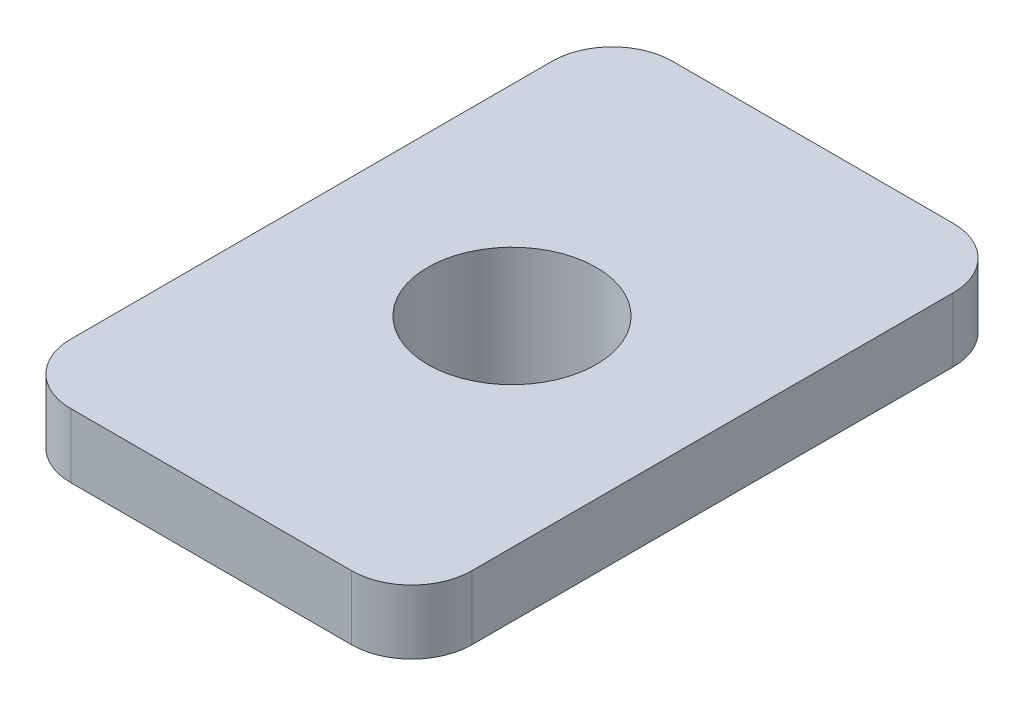
ISO-10303-21;
HEADER;
FILE_DESCRIPTION(('STEP AP214'),'2;1');
FILE_NAME('part.step','',(''),(''),'','','');
FILE_SCHEMA(('AUTOMOTIVE_DESIGN { 1 0 10303 214 1 1 1 1 }'));
ENDSEC;
DATA;
#1=APPLICATION_CONTEXT('core data for automotive mechanical design processes');
#2=APPLICATION_PROTOCOL_DEFINITION('international standard','automotive_design',2000,#1);
#3=PRODUCT_CONTEXT('',#1,'mechanical');
#4=PRODUCT('Part','Part','',(#3));
#5=PRODUCT_RELATED_PRODUCT_CATEGORY('part','',(#4));
#6=PRODUCT_DEFINITION_FORMATION('','',#4);
#7=PRODUCT_DEFINITION_CONTEXT('part definition',#1,'design');
#8=PRODUCT_DEFINITION('design','',#6,#7);
#9=PRODUCT_DEFINITION_SHAPE('','',#8);
#10=(LENGTH_UNIT() NAMED_UNIT(*) SI_UNIT(.MILLI.,.METRE.));
#11=(NAMED_UNIT(*) PLANE_ANGLE_UNIT() SI_UNIT($,.RADIAN.));
#12=(NAMED_UNIT(*) SI_UNIT($,.STERADIAN.) SOLID_ANGLE_UNIT());
#13=UNCERTAINTY_MEASURE_WITH_UNIT(LENGTH_MEASURE(1.E-05),#10,'distance_accuracy_value','');
#14=(GEOMETRIC_REPRESENTATION_CONTEXT(3) GLOBAL_UNCERTAINTY_ASSIGNED_CONTEXT((#13)) GLOBAL_UNIT_ASSIGNED_CONTEXT((#10,
#11,#12)) REPRESENTATION_CONTEXT('',''));
#15=CARTESIAN_POINT('',(0.,0.,0.));
#16=DIRECTION('',(0.,0.,1.));
#17=DIRECTION('',(1.,0.,0.));
#18=AXIS2_PLACEMENT_3D('',#15,#16,#17);
#19=CARTESIAN_POINT('',(-8.88178419700125E-13,1.59999999999971,0.));
#20=DIRECTION('',(0.999999999999941,0.,0.));
#21=DIRECTION('',(0.,0.,-0.999999999999963));
#22=AXIS2_PLACEMENT_3D('',#19,#20,#21);
#23=PLANE('',#22);
#24=DIRECTION('',(0.,0.,0.999999999999963));
#25=VECTOR('',#24,1.);
#26=CARTESIAN_POINT('',(-8.88178419700125E-13,1.59999999999971,0.));
#27=LINE('',#26,#25);
#28=CARTESIAN_POINT('',(-2.33146835171283E-12,1.60000000000038,-13.5000000000005));
#29=VERTEX_POINT('',#28);
#30=CARTESIAN_POINT('',(-2.62290189567693E-12,1.59999999999955,-1.49999999999983));
#31=VERTEX_POINT('',#30);
#32=EDGE_CURVE('E136',#29,#31,#27,.T.);
#33=ORIENTED_EDGE('',*,*,#32,.F.);
#34=DIRECTION('',(0.,-0.999999999999948,0.));
#35=VECTOR('',#34,1.);
#36=CARTESIAN_POINT('',(-2.33146835171283E-12,1.60000000000038,-13.5000000000005));
#37=LINE('',#36,#35);
#38=CARTESIAN_POINT('',(-6.10622663543836E-13,7.7715611723761E-13,-13.4999999999993));
#39=VERTEX_POINT('',#38);
#40=EDGE_CURVE('E121',#29,#39,#37,.T.);
#41=ORIENTED_EDGE('',*,*,#40,.T.);
#42=DIRECTION('',(0.,0.,0.999999999999963));
#43=VECTOR('',#42,1.);
#44=CARTESIAN_POINT('',(0.,0.,0.));
#45=LINE('',#44,#43);
#46=CARTESIAN_POINT('',(-1.94289029309402E-13,-4.44089209850063E-13,-1.50000000000045));
#47=VERTEX_POINT('',#46);
#48=EDGE_CURVE('E133',#39,#47,#45,.T.);
#49=ORIENTED_EDGE('',*,*,#48,.T.);
#50=DIRECTION('',(0.,-0.999999999999948,0.));
#51=VECTOR('',#50,1.);
#52=CARTESIAN_POINT('',(-2.62290189567693E-12,1.59999999999955,-1.49999999999983));
#53=LINE('',#52,#51);
#54=EDGE_CURVE('E138',#47,#31,#53,.F.);
#55=ORIENTED_EDGE('',*,*,#54,.T.);
#56=EDGE_LOOP('',(#33,#41,#49,#55));
#57=FACE_BOUND('',#56,.T.);
#58=ADVANCED_FACE('F50',(#57),#23,.F.);
#59=CARTESIAN_POINT('',(-8.88178419700125E-13,1.59999999999971,0.));
#60=DIRECTION('',(0.,0.,-0.999999999999963));
#61=DIRECTION('',(-0.999999999999941,0.,0.));
#62=AXIS2_PLACEMENT_3D('',#59,#60,#61);
#63=PLANE('',#62);
#64=DIRECTION('',(0.999999999999941,0.,0.));
#65=VECTOR('',#64,1.);
#66=CARTESIAN_POINT('',(-8.88178419700125E-13,1.59999999999971,0.));
#67=LINE('',#66,#65);
#68=CARTESIAN_POINT('',(1.49999999999869,1.59999999999971,2.22044604925031E-13));
#69=VERTEX_POINT('',#68);
#70=CARTESIAN_POINT('',(8.49999999999956,1.59999999999949,-1.60982338570648E-12));
#71=VERTEX_POINT('',#70);
#72=EDGE_CURVE('E234',#69,#71,#67,.T.);
#73=ORIENTED_EDGE('',*,*,#72,.F.);
#74=DIRECTION('',(0.,-0.999999999999948,0.));
#75=VECTOR('',#74,1.);
#76=CARTESIAN_POINT('',(1.49999999999869,1.59999999999971,2.22044604925031E-13));
#77=LINE('',#76,#75);
#78=CARTESIAN_POINT('',(1.49999999999983,1.66533453693773E-13,-1.83186799063151E-12));
#79=VERTEX_POINT('',#78);
#80=EDGE_CURVE('E179',#69,#79,#77,.T.);
#81=ORIENTED_EDGE('',*,*,#80,.T.);
#82=DIRECTION('',(0.999999999999941,0.,0.));
#83=VECTOR('',#82,1.);
#84=CARTESIAN_POINT('',(0.,0.,0.));
#85=LINE('',#84,#83);
#86=CARTESIAN_POINT('',(8.49999999999879,-2.22044604925031E-13,-1.11022302462516E-13));
#87=VERTEX_POINT('',#86);
#88=EDGE_CURVE('E143',#79,#87,#85,.T.);
#89=ORIENTED_EDGE('',*,*,#88,.T.);
#90=DIRECTION('',(0.,-0.999999999999948,0.));
#91=VECTOR('',#90,1.);
#92=CARTESIAN_POINT('',(8.49999999999956,1.59999999999949,-1.60982338570648E-12));
#93=LINE('',#92,#91);
#94=EDGE_CURVE('E177',#87,#71,#93,.F.);
#95=ORIENTED_EDGE('',*,*,#94,.T.);
#96=EDGE_LOOP('',(#73,#81,#89,#95));
#97=FACE_BOUND('',#96,.T.);
#98=ADVANCED_FACE('F198',(#97),#63,.F.);
#99=CARTESIAN_POINT('',(10.0000000000001,1.59999999999921,-8.32667268468867E-13));
#100=DIRECTION('',(-0.999999999999941,0.,0.));
#101=DIRECTION('',(0.,0.,0.999999999999963));
#102=AXIS2_PLACEMENT_3D('',#99,#100,#101);
#103=PLANE('',#102);
#104=DIRECTION('',(0.,0.,-0.999999999999963));
#105=VECTOR('',#104,1.);
#106=CARTESIAN_POINT('',(9.99999999999907,-9.99200722162641E-13,3.88578058618805E-13));
#107=LINE('',#106,#105);
#108=CARTESIAN_POINT('',(9.9999999999994,-2.22044604925031E-13,-1.49999999999989));
#109=VERTEX_POINT('',#108);
#110=CARTESIAN_POINT('',(9.9999999999979,-3.21964677141295E-12,-13.4999999999993));
#111=VERTEX_POINT('',#110);
#112=EDGE_CURVE('E147',#109,#111,#107,.T.);
#113=ORIENTED_EDGE('',*,*,#112,.T.);
#114=DIRECTION('',(0.,-0.999999999999948,0.));
#115=VECTOR('',#114,1.);
#116=CARTESIAN_POINT('',(9.99999999999801,1.59999999999738,-13.5000000000013));
#117=LINE('',#116,#115);
#118=CARTESIAN_POINT('',(9.99999999999801,1.59999999999738,-13.5000000000013));
#119=VERTEX_POINT('',#118);
#120=EDGE_CURVE('E65',#111,#119,#117,.F.);
#121=ORIENTED_EDGE('',*,*,#120,.T.);
#122=DIRECTION('',(0.,0.,-0.999999999999963));
#123=VECTOR('',#122,1.);
#124=CARTESIAN_POINT('',(10.0000000000001,1.59999999999921,-8.32667268468867E-13));
#125=LINE('',#124,#123);
#126=CARTESIAN_POINT('',(9.99999999999675,1.59999999999916,-1.50000000000058));
#127=VERTEX_POINT('',#126);
#128=EDGE_CURVE('E227',#127,#119,#125,.T.);
#129=ORIENTED_EDGE('',*,*,#128,.F.);
#130=DIRECTION('',(0.,-0.999999999999948,0.));
#131=VECTOR('',#130,1.);
#132=CARTESIAN_POINT('',(9.99999999999675,1.59999999999916,-1.50000000000058));
#133=LINE('',#132,#131);
#134=EDGE_CURVE('E173',#127,#109,#133,.T.);
#135=ORIENTED_EDGE('',*,*,#134,.T.);
#136=EDGE_LOOP('',(#113,#121,#129,#135));
#137=FACE_BOUND('',#136,.T.);
#138=ADVANCED_FACE('F203',(#137),#103,.F.);
#139=CARTESIAN_POINT('',(-4.02455846426619E-13,1.60000000000082,-15.0000000000001));
#140=DIRECTION('',(0.,0.,0.999999999999963));
#141=DIRECTION('',(0.999999999999941,0.,0.));
#142=AXIS2_PLACEMENT_3D('',#139,#140,#141);
#143=PLANE('',#142);
#144=DIRECTION('',(-0.999999999999941,0.,0.));
#145=VECTOR('',#144,1.);
#146=CARTESIAN_POINT('',(-1.83186799063151E-12,7.21644966006352E-13,-14.9999999999991));
#147=LINE('',#146,#145);
#148=CARTESIAN_POINT('',(8.49999999999687,-2.77555756156289E-12,-15.0000000000009));
#149=VERTEX_POINT('',#148);
#150=CARTESIAN_POINT('',(1.49999999999698,1.55431223447522E-12,-15.0000000000008));
#151=VERTEX_POINT('',#150);
#152=EDGE_CURVE('E157',#149,#151,#147,.T.);
#153=ORIENTED_EDGE('',*,*,#152,.T.);
#154=DIRECTION('',(0.,-0.999999999999948,0.));
#155=VECTOR('',#154,1.);
#156=CARTESIAN_POINT('',(1.49999999999949,1.59999999999949,-14.9999999999996));
#157=LINE('',#156,#155);
#158=CARTESIAN_POINT('',(1.49999999999949,1.59999999999949,-14.9999999999996));
#159=VERTEX_POINT('',#158);
#160=EDGE_CURVE('E122',#151,#159,#157,.F.);
#161=ORIENTED_EDGE('',*,*,#160,.T.);
#162=DIRECTION('',(-0.999999999999941,0.,0.));
#163=VECTOR('',#162,1.);
#164=CARTESIAN_POINT('',(-4.02455846426619E-13,1.60000000000082,-15.0000000000001));
#165=LINE('',#164,#163);
#166=CARTESIAN_POINT('',(8.49999999999727,1.59999999999755,-15.0000000000011));
#167=VERTEX_POINT('',#166);
#168=EDGE_CURVE('E153',#167,#159,#165,.T.);
#169=ORIENTED_EDGE('',*,*,#168,.F.);
#170=DIRECTION('',(0.,-0.999999999999948,0.));
#171=VECTOR('',#170,1.);
#172=CARTESIAN_POINT('',(8.49999999999727,1.59999999999755,-15.0000000000011));
#173=LINE('',#172,#171);
#174=EDGE_CURVE('E127',#167,#149,#173,.T.);
#175=ORIENTED_EDGE('',*,*,#174,.T.);
#176=EDGE_LOOP('',(#153,#161,#169,#175));
#177=FACE_BOUND('',#176,.T.);
#178=ADVANCED_FACE('F232',(#177),#143,.F.);
#179=CARTESIAN_POINT('',(-8.88178419700125E-13,1.59999999999971,0.));
#180=DIRECTION('',(0.,-0.999999999999948,0.));
#181=DIRECTION('',(0.,0.,-0.999999999999963));
#182=AXIS2_PLACEMENT_3D('',#179,#180,#181);
#183=PLANE('',#182);
#184=CARTESIAN_POINT('',(4.99999999999794,1.59999999999771,-7.50000000000034));
#185=DIRECTION('',(0.,0.999999999999948,0.));
#186=DIRECTION('',(0.,0.,0.999999999999963));
#187=AXIS2_PLACEMENT_3D('',#184,#185,#186);
#188=CIRCLE('',#187,2.1);
#189=CARTESIAN_POINT('',(4.99999999999797,1.59999999999774,-5.40000000000042));
#190=VERTEX_POINT('',#189);
#191=EDGE_CURVE('E240',#190,#190,#188,.T.);
#192=ORIENTED_EDGE('',*,*,#191,.F.);
#193=EDGE_LOOP('',(#192));
#194=FACE_BOUND('',#193,.T.);
#195=ORIENTED_EDGE('',*,*,#168,.T.);
#196=CARTESIAN_POINT('',(1.49999999999767,1.60000000000027,-13.4999999999997));
#197=DIRECTION('',(0.,-0.999999999999948,0.));
#198=DIRECTION('',(0.,0.,-0.999999999999963));
#199=AXIS2_PLACEMENT_3D('',#196,#197,#198);
#200=CIRCLE('',#199,1.5);
#201=EDGE_CURVE('E171',#159,#29,#200,.F.);
#202=ORIENTED_EDGE('',*,*,#201,.T.);
#203=ORIENTED_EDGE('',*,*,#32,.T.);
#204=CARTESIAN_POINT('',(1.49999999999838,1.59999999999955,-1.50000000000014));
#205=DIRECTION('',(0.,-0.999999999999948,0.));
#206=DIRECTION('',(0.,0.,-0.999999999999963));
#207=AXIS2_PLACEMENT_3D('',#204,#205,#206);
#208=CIRCLE('',#207,1.5);
#209=EDGE_CURVE('E167',#31,#69,#208,.F.);
#210=ORIENTED_EDGE('',*,*,#209,.T.);
#211=ORIENTED_EDGE('',*,*,#72,.T.);
#212=CARTESIAN_POINT('',(8.49999999999722,1.59999999999955,-1.50000000000161));
#213=DIRECTION('',(0.,-0.999999999999948,0.));
#214=DIRECTION('',(0.,0.,-0.999999999999963));
#215=AXIS2_PLACEMENT_3D('',#212,#213,#214);
#216=CIRCLE('',#215,1.5);
#217=EDGE_CURVE('E72',#71,#127,#216,.F.);
#218=ORIENTED_EDGE('',*,*,#217,.T.);
#219=ORIENTED_EDGE('',*,*,#128,.T.);
#220=CARTESIAN_POINT('',(8.49999999999734,1.59999999999616,-13.5000000000014));
#221=DIRECTION('',(0.,-0.999999999999948,0.));
#222=DIRECTION('',(0.,0.,-0.999999999999963));
#223=AXIS2_PLACEMENT_3D('',#220,#221,#222);
#224=CIRCLE('',#223,1.5);
#225=EDGE_CURVE('E169',#119,#167,#224,.F.);
#226=ORIENTED_EDGE('',*,*,#225,.T.);
#227=EDGE_LOOP('',(#195,#202,#203,#210,#211,#218,#219,#226));
#228=FACE_BOUND('',#227,.T.);
#229=ADVANCED_FACE('F245',(#194,#228),#183,.F.);
#230=CARTESIAN_POINT('',(0.,0.,0.));
#231=DIRECTION('',(0.,-0.999999999999948,0.));
#232=DIRECTION('',(0.,0.,-0.999999999999963));
#233=AXIS2_PLACEMENT_3D('',#230,#231,#232);
#234=PLANE('',#233);
#235=CARTESIAN_POINT('',(4.99999999999953,-2.38697950294409E-12,-7.50000000000095));
#236=DIRECTION('',(0.,-0.999999999999948,0.));
#237=DIRECTION('',(0.999999999999941,0.,0.));
#238=AXIS2_PLACEMENT_3D('',#235,#236,#237);
#239=CIRCLE('',#238,3.85);
#240=CARTESIAN_POINT('',(8.8499999999993,-2.39261802226164E-12,-7.50000000000089));
#241=VERTEX_POINT('',#240);
#242=EDGE_CURVE('E13',#241,#241,#239,.F.);
#243=ORIENTED_EDGE('',*,*,#242,.T.);
#244=EDGE_LOOP('',(#243));
#245=FACE_BOUND('',#244,.T.);
#246=ORIENTED_EDGE('',*,*,#48,.F.);
#247=CARTESIAN_POINT('',(1.49999999999839,-2.22044604925031E-13,-13.5000000000012));
#248=DIRECTION('',(0.,-0.999999999999948,0.));
#249=DIRECTION('',(0.,0.,-0.999999999999963));
#250=AXIS2_PLACEMENT_3D('',#247,#248,#249);
#251=CIRCLE('',#250,1.5);
#252=EDGE_CURVE('E117',#39,#151,#251,.T.);
#253=ORIENTED_EDGE('',*,*,#252,.T.);
#254=ORIENTED_EDGE('',*,*,#152,.F.);
#255=CARTESIAN_POINT('',(8.49999999999784,-3.5527136788005E-12,-13.5000000000009));
#256=DIRECTION('',(0.,-0.999999999999948,0.));
#257=DIRECTION('',(0.,0.,-0.999999999999963));
#258=AXIS2_PLACEMENT_3D('',#255,#256,#257);
#259=CIRCLE('',#258,1.5);
#260=EDGE_CURVE('E128',#149,#111,#259,.T.);
#261=ORIENTED_EDGE('',*,*,#260,.T.);
#262=ORIENTED_EDGE('',*,*,#112,.F.);
#263=CARTESIAN_POINT('',(8.49999999999854,-1.11022302462516E-12,-1.5000000000005));
#264=DIRECTION('',(0.,-0.999999999999948,0.));
#265=DIRECTION('',(0.,0.,-0.999999999999963));
#266=AXIS2_PLACEMENT_3D('',#263,#264,#265);
#267=CIRCLE('',#266,1.5);
#268=EDGE_CURVE('E137',#109,#87,#267,.T.);
#269=ORIENTED_EDGE('',*,*,#268,.T.);
#270=ORIENTED_EDGE('',*,*,#88,.F.);
#271=CARTESIAN_POINT('',(1.49999999999992,1.11022302462516E-13,-1.50000000000133));
#272=DIRECTION('',(0.,-0.999999999999948,0.));
#273=DIRECTION('',(0.,0.,-0.999999999999963));
#274=AXIS2_PLACEMENT_3D('',#271,#272,#273);
#275=CIRCLE('',#274,1.5);
#276=EDGE_CURVE('E142',#79,#47,#275,.T.);
#277=ORIENTED_EDGE('',*,*,#276,.T.);
#278=EDGE_LOOP('',(#246,#253,#254,#261,#262,#269,#270,#277));
#279=FACE_BOUND('',#278,.T.);
#280=ADVANCED_FACE('F140',(#245,#279),#234,.T.);
#281=CARTESIAN_POINT('',(1.49999999999767,1.60000000000027,-13.4999999999997));
#282=DIRECTION('',(0.,-0.999999999999948,0.));
#283=DIRECTION('',(0.,0.,-0.999999999999963));
#284=AXIS2_PLACEMENT_3D('',#281,#282,#283);
#285=CYLINDRICAL_SURFACE('',#284,1.5);
#286=ORIENTED_EDGE('',*,*,#201,.F.);
#287=ORIENTED_EDGE('',*,*,#160,.F.);
#288=ORIENTED_EDGE('',*,*,#252,.F.);
#289=ORIENTED_EDGE('',*,*,#40,.F.);
#290=EDGE_LOOP('',(#286,#287,#288,#289));
#291=FACE_BOUND('',#290,.T.);
#292=ADVANCED_FACE('F120',(#291),#285,.T.);
#293=CARTESIAN_POINT('',(8.49999999999734,1.59999999999616,-13.5000000000014));
#294=DIRECTION('',(0.,-0.999999999999948,0.));
#295=DIRECTION('',(0.,0.,-0.999999999999963));
#296=AXIS2_PLACEMENT_3D('',#293,#294,#295);
#297=CYLINDRICAL_SURFACE('',#296,1.5);
#298=ORIENTED_EDGE('',*,*,#225,.F.);
#299=ORIENTED_EDGE('',*,*,#120,.F.);
#300=ORIENTED_EDGE('',*,*,#260,.F.);
#301=ORIENTED_EDGE('',*,*,#174,.F.);
#302=EDGE_LOOP('',(#298,#299,#300,#301));
#303=FACE_BOUND('',#302,.T.);
#304=ADVANCED_FACE('F210',(#303),#297,.T.);
#305=CARTESIAN_POINT('',(1.49999999999838,1.59999999999955,-1.50000000000014));
#306=DIRECTION('',(0.,-0.999999999999948,0.));
#307=DIRECTION('',(0.,0.,-0.999999999999963));
#308=AXIS2_PLACEMENT_3D('',#305,#306,#307);
#309=CYLINDRICAL_SURFACE('',#308,1.5);
#310=ORIENTED_EDGE('',*,*,#209,.F.);
#311=ORIENTED_EDGE('',*,*,#54,.F.);
#312=ORIENTED_EDGE('',*,*,#276,.F.);
#313=ORIENTED_EDGE('',*,*,#80,.F.);
#314=EDGE_LOOP('',(#310,#311,#312,#313));
#315=FACE_BOUND('',#314,.T.);
#316=ADVANCED_FACE('F213',(#315),#309,.T.);
#317=CARTESIAN_POINT('',(8.49999999999722,1.59999999999955,-1.50000000000161));
#318=DIRECTION('',(0.,-0.999999999999948,0.));
#319=DIRECTION('',(0.,0.,-0.999999999999963));
#320=AXIS2_PLACEMENT_3D('',#317,#318,#319);
#321=CYLINDRICAL_SURFACE('',#320,1.5);
#322=ORIENTED_EDGE('',*,*,#217,.F.);
#323=ORIENTED_EDGE('',*,*,#94,.F.);
#324=ORIENTED_EDGE('',*,*,#268,.F.);
#325=ORIENTED_EDGE('',*,*,#134,.F.);
#326=EDGE_LOOP('',(#322,#323,#324,#325));
#327=FACE_BOUND('',#326,.T.);
#328=ADVANCED_FACE('F216',(#327),#321,.T.);
#329=CARTESIAN_POINT('',(5.00000000000041,-1.40000000000268,-7.50000000000187));
#330=DIRECTION('',(0.,0.999999999999948,0.));
#331=DIRECTION('',(0.,0.,0.999999999999963));
#332=AXIS2_PLACEMENT_3D('',#329,#330,#331);
#333=CYLINDRICAL_SURFACE('',#332,3.45);
#334=CARTESIAN_POINT('',(5.00000000000075,-0.400000000002232,-7.50000000000178));
#335=DIRECTION('',(0.,-0.999999999999948,0.));
#336=DIRECTION('',(0.999999999999941,0.,0.));
#337=AXIS2_PLACEMENT_3D('',#334,#335,#336);
#338=CIRCLE('',#337,3.45);
#339=CARTESIAN_POINT('',(5.00000000000046,-0.400000000002191,-4.05000000000201));
#340=VERTEX_POINT('',#339);
#341=EDGE_CURVE('E58',#340,#340,#338,.T.);
#342=CARTESIAN_POINT('',(5.00000000000041,-1.40000000000268,-7.50000000000187));
#343=DIRECTION('',(0.,-0.999999999999948,0.));
#344=DIRECTION('',(0.,0.,-0.999999999999963));
#345=AXIS2_PLACEMENT_3D('',#342,#343,#344);
#346=CIRCLE('',#345,3.45);
#347=CARTESIAN_POINT('',(5.00000000000047,-1.40000000000264,-4.05000000000199));
#348=VERTEX_POINT('',#347);
#349=EDGE_CURVE('E144',#348,#348,#346,.T.);
#350=CARTESIAN_POINT('',(5.00000000000046,-0.400000000002191,-4.05000000000201));
#351=CARTESIAN_POINT('',(5.00000000000046,-0.410416666668863,-4.05000000000201));
#352=CARTESIAN_POINT('',(5.00000000000046,-0.420833333335534,-4.05000000000201));
#353=CARTESIAN_POINT('',(5.00000000000046,-0.441666666668876,-4.05000000000201));
#354=CARTESIAN_POINT('',(5.00000000000046,-0.452083333335548,-4.05000000000201));
#355=CARTESIAN_POINT('',(5.00000000000046,-0.47291666666889,-4.05000000000201));
#356=CARTESIAN_POINT('',(5.00000000000046,-0.483333333335562,-4.05000000000201));
#357=CARTESIAN_POINT('',(5.00000000000046,-0.504166666668904,-4.05000000000201));
#358=CARTESIAN_POINT('',(5.00000000000046,-0.514583333335576,-4.05000000000201));
#359=CARTESIAN_POINT('',(5.00000000000046,-0.535416666668918,-4.05000000000201));
#360=CARTESIAN_POINT('',(5.00000000000046,-0.545833333335589,-4.050000000002));
#361=CARTESIAN_POINT('',(5.00000000000046,-0.566666666668932,-4.050000000002));
#362=CARTESIAN_POINT('',(5.00000000000046,-0.577083333335604,-4.050000000002));
#363=CARTESIAN_POINT('',(5.00000000000046,-0.597916666668946,-4.050000000002));
#364=CARTESIAN_POINT('',(5.00000000000046,-0.608333333335617,-4.050000000002));
#365=CARTESIAN_POINT('',(5.00000000000046,-0.62916666666896,-4.050000000002));
#366=CARTESIAN_POINT('',(5.00000000000046,-0.639583333335631,-4.050000000002));
#367=CARTESIAN_POINT('',(5.00000000000046,-0.660416666668974,-4.050000000002));
#368=CARTESIAN_POINT('',(5.00000000000046,-0.670833333335645,-4.050000000002));
#369=CARTESIAN_POINT('',(5.00000000000046,-0.691666666668988,-4.050000000002));
#370=CARTESIAN_POINT('',(5.00000000000046,-0.702083333335659,-4.050000000002));
#371=CARTESIAN_POINT('',(5.00000000000046,-0.722916666669002,-4.050000000002));
#372=CARTESIAN_POINT('',(5.00000000000046,-0.733333333335673,-4.050000000002));
#373=CARTESIAN_POINT('',(5.00000000000046,-0.754166666669016,-4.050000000002));
#374=CARTESIAN_POINT('',(5.00000000000046,-0.764583333335687,-4.050000000002));
#375=CARTESIAN_POINT('',(5.00000000000046,-0.78541666666903,-4.050000000002));
#376=CARTESIAN_POINT('',(5.00000000000046,-0.795833333335701,-4.050000000002));
#377=CARTESIAN_POINT('',(5.00000000000046,-0.816666666669043,-4.050000000002));
#378=CARTESIAN_POINT('',(5.00000000000046,-0.827083333335715,-4.050000000002));
#379=CARTESIAN_POINT('',(5.00000000000046,-0.847916666669057,-4.050000000002));
#380=CARTESIAN_POINT('',(5.00000000000046,-0.858333333335729,-4.050000000002));
#381=CARTESIAN_POINT('',(5.00000000000046,-0.879166666669071,-4.050000000002));
#382=CARTESIAN_POINT('',(5.00000000000046,-0.889583333335743,-4.050000000002));
#383=CARTESIAN_POINT('',(5.00000000000046,-0.910416666669085,-4.050000000002));
#384=CARTESIAN_POINT('',(5.00000000000046,-0.920833333335756,-4.050000000002));
#385=CARTESIAN_POINT('',(5.00000000000046,-0.941666666669099,-4.050000000002));
#386=CARTESIAN_POINT('',(5.00000000000046,-0.95208333333577,-4.050000000002));
#387=CARTESIAN_POINT('',(5.00000000000046,-0.972916666669113,-4.050000000002));
#388=CARTESIAN_POINT('',(5.00000000000046,-0.983333333335784,-4.050000000002));
#389=CARTESIAN_POINT('',(5.00000000000046,-1.00416666666913,-4.050000000002));
#390=CARTESIAN_POINT('',(5.00000000000047,-1.0145833333358,-4.050000000002));
#391=CARTESIAN_POINT('',(5.00000000000047,-1.03541666666914,-4.050000000002));
#392=CARTESIAN_POINT('',(5.00000000000047,-1.04583333333581,-4.050000000002));
#393=CARTESIAN_POINT('',(5.00000000000047,-1.06666666666915,-4.050000000002));
#394=CARTESIAN_POINT('',(5.00000000000047,-1.07708333333583,-4.050000000002));
#395=CARTESIAN_POINT('',(5.00000000000047,-1.09791666666917,-4.050000000002));
#396=CARTESIAN_POINT('',(5.00000000000047,-1.10833333333584,-4.050000000002));
#397=CARTESIAN_POINT('',(5.00000000000047,-1.12916666666918,-4.050000000002));
#398=CARTESIAN_POINT('',(5.00000000000047,-1.13958333333585,-4.050000000002));
#399=CARTESIAN_POINT('',(5.00000000000047,-1.1604166666692,-4.050000000002));
#400=CARTESIAN_POINT('',(5.00000000000047,-1.17083333333587,-4.050000000002));
#401=CARTESIAN_POINT('',(5.00000000000047,-1.19166666666921,-4.050000000002));
#402=CARTESIAN_POINT('',(5.00000000000047,-1.20208333333588,-4.050000000002));
#403=CARTESIAN_POINT('',(5.00000000000047,-1.22291666666922,-4.050000000002));
#404=CARTESIAN_POINT('',(5.00000000000047,-1.2333333333359,-4.050000000002));
#405=CARTESIAN_POINT('',(5.00000000000047,-1.25416666666924,-4.050000000002));
#406=CARTESIAN_POINT('',(5.00000000000047,-1.26458333333591,-4.050000000002));
#407=CARTESIAN_POINT('',(5.00000000000047,-1.28541666666925,-4.050000000002));
#408=CARTESIAN_POINT('',(5.00000000000047,-1.29583333333592,-4.050000000002));
#409=CARTESIAN_POINT('',(5.00000000000047,-1.31666666666927,-4.050000000002));
#410=CARTESIAN_POINT('',(5.00000000000047,-1.32708333333594,-4.050000000002));
#411=CARTESIAN_POINT('',(5.00000000000047,-1.34791666666928,-4.050000000002));
#412=CARTESIAN_POINT('',(5.00000000000047,-1.35833333333595,-4.05000000000199));
#413=CARTESIAN_POINT('',(5.00000000000047,-1.37916666666929,-4.05000000000199));
#414=CARTESIAN_POINT('',(5.00000000000047,-1.38958333333597,-4.05000000000199));
#415=CARTESIAN_POINT('',(5.00000000000047,-1.40000000000264,-4.05000000000199));
#416=B_SPLINE_CURVE_WITH_KNOTS('',3,(#350,#351,#352,#353,#354,#355,#356,#357,#358,#359,#360,
#361,#362,#363,#364,#365,#366,#367,#368,#369,#370,#371,#372,#373,#374,#375,#376,#377,#378,#379,
#380,#381,#382,#383,#384,#385,#386,#387,#388,#389,#390,#391,#392,#393,#394,#395,#396,#397,#398,
#399,#400,#401,#402,#403,#404,#405,#406,#407,#408,#409,#410,#411,#412,#413,#414,#415),
.UNSPECIFIED.,.F.,.F.,(4,2,2,2,2,2,2,2,2,2,2,2,2,2,2,2,2,2,2,2,2,2,2,2,2,2,2,2,2,2,2,2,4),(0.,
0.0312500000000138,0.0625000000000277,0.0937500000000416,0.125000000000056,0.15625000000007,
0.187500000000083,0.218750000000097,0.250000000000111,0.281250000000125,0.312500000000139,
0.343750000000153,0.375000000000167,0.406250000000181,0.437500000000195,0.468750000000209,
0.500000000000222,0.531250000000236,0.56250000000025,0.593750000000264,0.625000000000278,
0.656250000000292,0.687500000000306,0.71875000000032,0.750000000000334,0.781250000000348,
0.812500000000361,0.843750000000375,0.875000000000389,0.906250000000403,0.937500000000417,
0.968750000000431,1.00000000000044),.UNSPECIFIED.);
#417=EDGE_CURVE('BSEAM184',#340,#348,#416,.T.);
#418=ORIENTED_EDGE('',*,*,#341,.T.);
#419=ORIENTED_EDGE('',*,*,#349,.F.);
#420=ORIENTED_EDGE('',*,*,#417,.T.);
#421=ORIENTED_EDGE('',*,*,#417,.F.);
#422=EDGE_LOOP('',(#418,#420,#419,#421));
#423=FACE_BOUND('',#422,.T.);
#424=ADVANCED_FACE('F184',(#423),#333,.T.);
#425=CARTESIAN_POINT('',(5.00000000000041,-1.40000000000268,-7.50000000000187));
#426=DIRECTION('',(0.,-0.999999999999948,0.));
#427=DIRECTION('',(0.,0.,-0.999999999999963));
#428=AXIS2_PLACEMENT_3D('',#425,#426,#427);
#429=PLANE('',#428);
#430=CARTESIAN_POINT('',(5.00000000000041,-1.40000000000268,-7.50000000000187));
#431=DIRECTION('',(0.,0.999999999999948,0.));
#432=DIRECTION('',(0.,0.,0.999999999999963));
#433=AXIS2_PLACEMENT_3D('',#430,#431,#432);
#434=CIRCLE('',#433,2.1);
#435=CARTESIAN_POINT('',(4.99999999999799,-1.40000000000265,-5.40000000000038));
#436=VERTEX_POINT('',#435);
#437=EDGE_CURVE('E150',#436,#436,#434,.T.);
#438=ORIENTED_EDGE('',*,*,#437,.T.);
#439=EDGE_LOOP('',(#438));
#440=FACE_BOUND('',#439,.T.);
#441=ORIENTED_EDGE('',*,*,#349,.T.);
#442=EDGE_LOOP('',(#441));
#443=FACE_BOUND('',#442,.T.);
#444=ADVANCED_FACE('F193',(#440,#443),#429,.T.);
#445=CARTESIAN_POINT('',(4.99999999999794,1.59999999999771,-7.50000000000034));
#446=DIRECTION('',(0.,0.999999999999948,0.));
#447=DIRECTION('',(0.,0.,0.999999999999963));
#448=AXIS2_PLACEMENT_3D('',#445,#446,#447);
#449=CYLINDRICAL_SURFACE('',#448,2.1);
#450=CARTESIAN_POINT('',(4.99999999999799,-1.40000000000265,-5.40000000000038));
#451=CARTESIAN_POINT('',(4.99999999999799,-1.36875000000265,-5.40000000000038));
#452=CARTESIAN_POINT('',(4.99999999999799,-1.33750000000264,-5.40000000000038));
#453=CARTESIAN_POINT('',(4.99999999999799,-1.27500000000264,-5.40000000000038));
#454=CARTESIAN_POINT('',(4.99999999999799,-1.24375000000263,-5.40000000000038));
#455=CARTESIAN_POINT('',(4.99999999999799,-1.18125000000262,-5.40000000000038));
#456=CARTESIAN_POINT('',(4.99999999999799,-1.15000000000262,-5.40000000000039));
#457=CARTESIAN_POINT('',(4.99999999999799,-1.08750000000261,-5.40000000000039));
#458=CARTESIAN_POINT('',(4.99999999999799,-1.05625000000261,-5.40000000000039));
#459=CARTESIAN_POINT('',(4.99999999999799,-0.993750000002599,-5.40000000000039));
#460=CARTESIAN_POINT('',(4.99999999999799,-0.962500000002595,-5.40000000000039));
#461=CARTESIAN_POINT('',(4.99999999999799,-0.900000000002586,-5.40000000000039));
#462=CARTESIAN_POINT('',(4.99999999999799,-0.868750000002582,-5.40000000000039));
#463=CARTESIAN_POINT('',(4.99999999999799,-0.806250000002574,-5.40000000000039));
#464=CARTESIAN_POINT('',(4.99999999999799,-0.77500000000257,-5.40000000000039));
#465=CARTESIAN_POINT('',(4.99999999999799,-0.712500000002562,-5.40000000000039));
#466=CARTESIAN_POINT('',(4.99999999999799,-0.681250000002558,-5.40000000000039));
#467=CARTESIAN_POINT('',(4.99999999999799,-0.61875000000255,-5.40000000000039));
#468=CARTESIAN_POINT('',(4.99999999999799,-0.587500000002546,-5.40000000000039));
#469=CARTESIAN_POINT('',(4.99999999999799,-0.525000000002537,-5.40000000000039));
#470=CARTESIAN_POINT('',(4.99999999999798,-0.493750000002533,-5.40000000000039));
#471=CARTESIAN_POINT('',(4.99999999999798,-0.431250000002525,-5.40000000000039));
#472=CARTESIAN_POINT('',(4.99999999999798,-0.400000000002521,-5.40000000000039));
#473=CARTESIAN_POINT('',(4.99999999999798,-0.337500000002513,-5.40000000000039));
#474=CARTESIAN_POINT('',(4.99999999999798,-0.306250000002509,-5.40000000000039));
#475=CARTESIAN_POINT('',(4.99999999999798,-0.243750000002501,-5.4000000000004));
#476=CARTESIAN_POINT('',(4.99999999999798,-0.212500000002497,-5.4000000000004));
#477=CARTESIAN_POINT('',(4.99999999999798,-0.150000000002489,-5.4000000000004));
#478=CARTESIAN_POINT('',(4.99999999999798,-0.118750000002485,-5.4000000000004));
#479=CARTESIAN_POINT('',(4.99999999999798,-0.0562500000024765,-5.4000000000004));
#480=CARTESIAN_POINT('',(4.99999999999798,-0.0250000000024725,-5.4000000000004));
#481=CARTESIAN_POINT('',(4.99999999999798,0.0374999999975355,-5.4000000000004));
#482=CARTESIAN_POINT('',(4.99999999999798,0.0687499999975396,-5.4000000000004));
#483=CARTESIAN_POINT('',(4.99999999999798,0.131249999997548,-5.4000000000004));
#484=CARTESIAN_POINT('',(4.99999999999798,0.162499999997552,-5.4000000000004));
#485=CARTESIAN_POINT('',(4.99999999999798,0.22499999999756,-5.4000000000004));
#486=CARTESIAN_POINT('',(4.99999999999798,0.256249999997564,-5.4000000000004));
#487=CARTESIAN_POINT('',(4.99999999999798,0.318749999997572,-5.4000000000004));
#488=CARTESIAN_POINT('',(4.99999999999798,0.349999999997576,-5.4000000000004));
#489=CARTESIAN_POINT('',(4.99999999999798,0.412499999997585,-5.4000000000004));
#490=CARTESIAN_POINT('',(4.99999999999798,0.443749999997589,-5.4000000000004));
#491=CARTESIAN_POINT('',(4.99999999999798,0.506249999997597,-5.40000000000041));
#492=CARTESIAN_POINT('',(4.99999999999798,0.537499999997601,-5.40000000000041));
#493=CARTESIAN_POINT('',(4.99999999999798,0.599999999997609,-5.40000000000041));
#494=CARTESIAN_POINT('',(4.99999999999798,0.631249999997613,-5.40000000000041));
#495=CARTESIAN_POINT('',(4.99999999999798,0.693749999997621,-5.40000000000041));
#496=CARTESIAN_POINT('',(4.99999999999798,0.724999999997625,-5.40000000000041));
#497=CARTESIAN_POINT('',(4.99999999999798,0.787499999997633,-5.40000000000041));
#498=CARTESIAN_POINT('',(4.99999999999798,0.818749999997637,-5.40000000000041));
#499=CARTESIAN_POINT('',(4.99999999999798,0.881249999997646,-5.40000000000041));
#500=CARTESIAN_POINT('',(4.99999999999798,0.91249999999765,-5.40000000000041));
#501=CARTESIAN_POINT('',(4.99999999999798,0.974999999997658,-5.40000000000041));
#502=CARTESIAN_POINT('',(4.99999999999798,1.00624999999766,-5.40000000000041));
#503=CARTESIAN_POINT('',(4.99999999999798,1.06874999999767,-5.40000000000041));
#504=CARTESIAN_POINT('',(4.99999999999798,1.09999999999767,-5.40000000000041));
#505=CARTESIAN_POINT('',(4.99999999999798,1.16249999999768,-5.40000000000041));
#506=CARTESIAN_POINT('',(4.99999999999797,1.19374999999769,-5.40000000000041));
#507=CARTESIAN_POINT('',(4.99999999999797,1.25624999999769,-5.40000000000041));
#508=CARTESIAN_POINT('',(4.99999999999797,1.2874999999977,-5.40000000000041));
#509=CARTESIAN_POINT('',(4.99999999999797,1.34999999999771,-5.40000000000041));
#510=CARTESIAN_POINT('',(4.99999999999797,1.38124999999771,-5.40000000000041));
#511=CARTESIAN_POINT('',(4.99999999999797,1.44374999999772,-5.40000000000042));
#512=CARTESIAN_POINT('',(4.99999999999797,1.47499999999772,-5.40000000000042));
#513=CARTESIAN_POINT('',(4.99999999999797,1.53749999999773,-5.40000000000042));
#514=CARTESIAN_POINT('',(4.99999999999797,1.56874999999774,-5.40000000000042));
#515=CARTESIAN_POINT('',(4.99999999999797,1.59999999999774,-5.40000000000042));
#516=B_SPLINE_CURVE_WITH_KNOTS('',3,(#450,#451,#452,#453,#454,#455,#456,#457,#458,#459,#460,
#461,#462,#463,#464,#465,#466,#467,#468,#469,#470,#471,#472,#473,#474,#475,#476,#477,#478,#479,
#480,#481,#482,#483,#484,#485,#486,#487,#488,#489,#490,#491,#492,#493,#494,#495,#496,#497,#498,
#499,#500,#501,#502,#503,#504,#505,#506,#507,#508,#509,#510,#511,#512,#513,#514,#515),
.UNSPECIFIED.,.F.,.F.,(4,2,2,2,2,2,2,2,2,2,2,2,2,2,2,2,2,2,2,2,2,2,2,2,2,2,2,2,2,2,2,2,4),(0.,
0.0937500000000122,0.187500000000025,0.281250000000037,0.375000000000049,0.468750000000061,
0.562500000000074,0.656250000000086,0.750000000000098,0.84375000000011,0.937500000000122,
1.03125000000013,1.12500000000015,1.21875000000016,1.31250000000017,1.40625000000018,
1.5000000000002,1.59375000000021,1.68750000000022,1.78125000000023,1.87500000000024,
1.96875000000026,2.06250000000027,2.15625000000028,2.25000000000029,2.34375000000031,
2.43750000000032,2.53125000000033,2.62500000000034,2.71875000000035,2.81250000000037,
2.90625000000038,3.00000000000039),.UNSPECIFIED.);
#517=EDGE_CURVE('BSEAM188',#436,#190,#516,.T.);
#518=ORIENTED_EDGE('',*,*,#437,.F.);
#519=ORIENTED_EDGE('',*,*,#191,.T.);
#520=ORIENTED_EDGE('',*,*,#517,.T.);
#521=ORIENTED_EDGE('',*,*,#517,.F.);
#522=EDGE_LOOP('',(#518,#520,#519,#521));
#523=FACE_BOUND('',#522,.T.);
#524=ADVANCED_FACE('F188',(#523),#449,.F.);
#525=CARTESIAN_POINT('',(5.00000000000075,-0.400000000002232,-7.50000000000178));
#526=DIRECTION('',(0.,-0.999999999999948,0.));
#527=DIRECTION('',(0.999999999999941,0.,0.));
#528=AXIS2_PLACEMENT_3D('',#525,#526,#527);
#529=TOROIDAL_SURFACE('',#528,3.85,0.4);
#530=ORIENTED_EDGE('',*,*,#242,.F.);
#531=EDGE_LOOP('',(#530));
#532=FACE_BOUND('',#531,.T.);
#533=ORIENTED_EDGE('',*,*,#341,.F.);
#534=EDGE_LOOP('',(#533));
#535=FACE_BOUND('',#534,.T.);
#536=ADVANCED_FACE('F52',(#532,#535),#529,.F.);
#537=CLOSED_SHELL('',(#58,#98,#138,#178,#229,#280,#292,#304,#316,#328,#424,#444,#524,#536));
#538=MANIFOLD_SOLID_BREP('B2',#537);
#539=ADVANCED_BREP_SHAPE_REPRESENTATION('',(#18,#538),#14);
#540=SHAPE_DEFINITION_REPRESENTATION(#9,#539);
ENDSEC;
END-ISO-10303-21;
